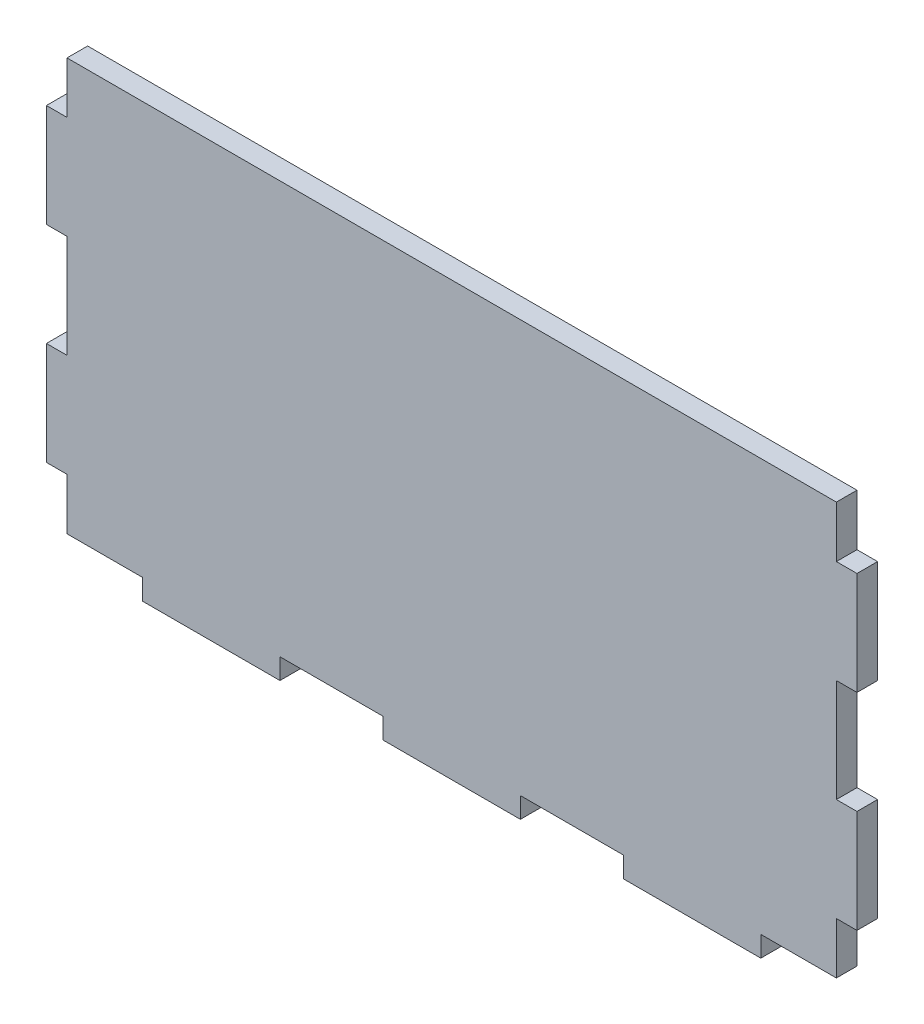
ISO-10303-21;
HEADER;
FILE_DESCRIPTION(('STEP AP214'),'2;1');
FILE_NAME('part.step','',(''),(''),'','','');
FILE_SCHEMA(('AUTOMOTIVE_DESIGN { 1 0 10303 214 1 1 1 1 }'));
ENDSEC;
DATA;
#1=APPLICATION_CONTEXT('core data for automotive mechanical design processes');
#2=APPLICATION_PROTOCOL_DEFINITION('international standard','automotive_design',2000,#1);
#3=PRODUCT_CONTEXT('',#1,'mechanical');
#4=PRODUCT('Part','Part','',(#3));
#5=PRODUCT_RELATED_PRODUCT_CATEGORY('part','',(#4));
#6=PRODUCT_DEFINITION_FORMATION('','',#4);
#7=PRODUCT_DEFINITION_CONTEXT('part definition',#1,'design');
#8=PRODUCT_DEFINITION('design','',#6,#7);
#9=PRODUCT_DEFINITION_SHAPE('','',#8);
#10=(LENGTH_UNIT() NAMED_UNIT(*) SI_UNIT(.MILLI.,.METRE.));
#11=(NAMED_UNIT(*) PLANE_ANGLE_UNIT() SI_UNIT($,.RADIAN.));
#12=(NAMED_UNIT(*) SI_UNIT($,.STERADIAN.) SOLID_ANGLE_UNIT());
#13=UNCERTAINTY_MEASURE_WITH_UNIT(LENGTH_MEASURE(1.E-05),#10,'distance_accuracy_value','');
#14=(GEOMETRIC_REPRESENTATION_CONTEXT(3) GLOBAL_UNCERTAINTY_ASSIGNED_CONTEXT((#13)) GLOBAL_UNIT_ASSIGNED_CONTEXT((#10,
#11,#12)) REPRESENTATION_CONTEXT('',''));
#15=CARTESIAN_POINT('',(0.,0.,0.));
#16=DIRECTION('',(0.,0.,1.));
#17=DIRECTION('',(1.,0.,0.));
#18=AXIS2_PLACEMENT_3D('',#15,#16,#17);
#19=CARTESIAN_POINT('',(0.,22.5,3.));
#20=DIRECTION('',(0.,1.,0.));
#21=DIRECTION('',(0.,0.,1.));
#22=AXIS2_PLACEMENT_3D('',#19,#20,#21);
#23=PLANE('',#22);
#24=DIRECTION('',(1.,0.,0.));
#25=VECTOR('',#24,1.);
#26=CARTESIAN_POINT('',(0.,22.5,0.));
#27=LINE('',#26,#25);
#28=CARTESIAN_POINT('',(-59.,22.5,0.));
#29=VERTEX_POINT('',#28);
#30=CARTESIAN_POINT('',(-56.,22.5,0.));
#31=VERTEX_POINT('',#30);
#32=EDGE_CURVE('E499',#29,#31,#27,.T.);
#33=ORIENTED_EDGE('',*,*,#32,.F.);
#34=DIRECTION('',(0.,0.,-1.));
#35=VECTOR('',#34,1.);
#36=CARTESIAN_POINT('',(-59.,22.5,3.));
#37=LINE('',#36,#35);
#38=CARTESIAN_POINT('',(-59.,22.5,3.));
#39=VERTEX_POINT('',#38);
#40=EDGE_CURVE('E504',#39,#29,#37,.T.);
#41=ORIENTED_EDGE('',*,*,#40,.F.);
#42=DIRECTION('',(1.,0.,0.));
#43=VECTOR('',#42,1.);
#44=CARTESIAN_POINT('',(0.,22.5,3.));
#45=LINE('',#44,#43);
#46=CARTESIAN_POINT('',(-56.,22.5,3.));
#47=VERTEX_POINT('',#46);
#48=EDGE_CURVE('E509',#39,#47,#45,.T.);
#49=ORIENTED_EDGE('',*,*,#48,.T.);
#50=DIRECTION('',(0.,0.,-1.));
#51=VECTOR('',#50,1.);
#52=CARTESIAN_POINT('',(-56.,22.5,3.));
#53=LINE('',#52,#51);
#54=EDGE_CURVE('E508',#47,#31,#53,.T.);
#55=ORIENTED_EDGE('',*,*,#54,.T.);
#56=EDGE_LOOP('',(#33,#41,#49,#55));
#57=FACE_BOUND('',#56,.T.);
#58=ADVANCED_FACE('F215',(#57),#23,.T.);
#59=CARTESIAN_POINT('',(-56.,0.,3.));
#60=DIRECTION('',(-1.,0.,0.));
#61=DIRECTION('',(0.,0.,1.));
#62=AXIS2_PLACEMENT_3D('',#59,#60,#61);
#63=PLANE('',#62);
#64=DIRECTION('',(0.,1.,0.));
#65=VECTOR('',#64,1.);
#66=CARTESIAN_POINT('',(-56.,0.,0.));
#67=LINE('',#66,#65);
#68=CARTESIAN_POINT('',(-56.,30.,0.));
#69=VERTEX_POINT('',#68);
#70=EDGE_CURVE('E498',#31,#69,#67,.T.);
#71=ORIENTED_EDGE('',*,*,#70,.F.);
#72=ORIENTED_EDGE('',*,*,#54,.F.);
#73=DIRECTION('',(0.,1.,0.));
#74=VECTOR('',#73,1.);
#75=CARTESIAN_POINT('',(-56.,0.,3.));
#76=LINE('',#75,#74);
#77=CARTESIAN_POINT('',(-56.,30.,3.));
#78=VERTEX_POINT('',#77);
#79=EDGE_CURVE('E750',#47,#78,#76,.T.);
#80=ORIENTED_EDGE('',*,*,#79,.T.);
#81=DIRECTION('',(0.,0.,-1.));
#82=VECTOR('',#81,1.);
#83=CARTESIAN_POINT('',(-56.,30.,3.));
#84=LINE('',#83,#82);
#85=EDGE_CURVE('E513',#78,#69,#84,.T.);
#86=ORIENTED_EDGE('',*,*,#85,.T.);
#87=EDGE_LOOP('',(#71,#72,#80,#86));
#88=FACE_BOUND('',#87,.T.);
#89=ADVANCED_FACE('F381',(#88),#63,.T.);
#90=CARTESIAN_POINT('',(45.,0.,3.));
#91=DIRECTION('',(-1.,0.,0.));
#92=DIRECTION('',(0.,0.,1.));
#93=AXIS2_PLACEMENT_3D('',#90,#91,#92);
#94=PLANE('',#93);
#95=DIRECTION('',(0.,1.,0.));
#96=VECTOR('',#95,1.);
#97=CARTESIAN_POINT('',(45.,0.,0.));
#98=LINE('',#97,#96);
#99=CARTESIAN_POINT('',(45.,-33.,0.));
#100=VERTEX_POINT('',#99);
#101=CARTESIAN_POINT('',(45.,-30.,0.));
#102=VERTEX_POINT('',#101);
#103=EDGE_CURVE('E493',#100,#102,#98,.T.);
#104=ORIENTED_EDGE('',*,*,#103,.T.);
#105=DIRECTION('',(0.,0.,-1.));
#106=VECTOR('',#105,1.);
#107=CARTESIAN_POINT('',(45.,-30.,3.));
#108=LINE('',#107,#106);
#109=CARTESIAN_POINT('',(45.,-30.,3.));
#110=VERTEX_POINT('',#109);
#111=EDGE_CURVE('E525',#110,#102,#108,.T.);
#112=ORIENTED_EDGE('',*,*,#111,.F.);
#113=DIRECTION('',(0.,1.,0.));
#114=VECTOR('',#113,1.);
#115=CARTESIAN_POINT('',(45.,0.,3.));
#116=LINE('',#115,#114);
#117=CARTESIAN_POINT('',(45.,-33.,3.));
#118=VERTEX_POINT('',#117);
#119=EDGE_CURVE('E757',#118,#110,#116,.T.);
#120=ORIENTED_EDGE('',*,*,#119,.F.);
#121=DIRECTION('',(0.,0.,-1.));
#122=VECTOR('',#121,1.);
#123=CARTESIAN_POINT('',(45.,-33.,3.));
#124=LINE('',#123,#122);
#125=EDGE_CURVE('E529',#118,#100,#124,.T.);
#126=ORIENTED_EDGE('',*,*,#125,.T.);
#127=EDGE_LOOP('',(#104,#112,#120,#126));
#128=FACE_BOUND('',#127,.T.);
#129=ADVANCED_FACE('F387',(#128),#94,.F.);
#130=CARTESIAN_POINT('',(0.,-33.,3.));
#131=DIRECTION('',(0.,1.,0.));
#132=DIRECTION('',(0.,0.,1.));
#133=AXIS2_PLACEMENT_3D('',#130,#131,#132);
#134=PLANE('',#133);
#135=DIRECTION('',(1.,0.,0.));
#136=VECTOR('',#135,1.);
#137=CARTESIAN_POINT('',(0.,-33.,0.));
#138=LINE('',#137,#136);
#139=CARTESIAN_POINT('',(25.,-33.,0.));
#140=VERTEX_POINT('',#139);
#141=EDGE_CURVE('E661',#140,#100,#138,.T.);
#142=ORIENTED_EDGE('',*,*,#141,.T.);
#143=ORIENTED_EDGE('',*,*,#125,.F.);
#144=DIRECTION('',(1.,0.,0.));
#145=VECTOR('',#144,1.);
#146=CARTESIAN_POINT('',(0.,-33.,3.));
#147=LINE('',#146,#145);
#148=CARTESIAN_POINT('',(25.,-33.,3.));
#149=VERTEX_POINT('',#148);
#150=EDGE_CURVE('E764',#149,#118,#147,.T.);
#151=ORIENTED_EDGE('',*,*,#150,.F.);
#152=DIRECTION('',(0.,0.,-1.));
#153=VECTOR('',#152,1.);
#154=CARTESIAN_POINT('',(25.,-33.,3.));
#155=LINE('',#154,#153);
#156=EDGE_CURVE('E533',#149,#140,#155,.T.);
#157=ORIENTED_EDGE('',*,*,#156,.T.);
#158=EDGE_LOOP('',(#142,#143,#151,#157));
#159=FACE_BOUND('',#158,.T.);
#160=ADVANCED_FACE('F413',(#159),#134,.F.);
#161=CARTESIAN_POINT('',(25.,0.,3.));
#162=DIRECTION('',(-1.,0.,0.));
#163=DIRECTION('',(0.,0.,1.));
#164=AXIS2_PLACEMENT_3D('',#161,#162,#163);
#165=PLANE('',#164);
#166=DIRECTION('',(0.,1.,0.));
#167=VECTOR('',#166,1.);
#168=CARTESIAN_POINT('',(25.,0.,0.));
#169=LINE('',#168,#167);
#170=CARTESIAN_POINT('',(25.,-30.,0.));
#171=VERTEX_POINT('',#170);
#172=EDGE_CURVE('E658',#140,#171,#169,.T.);
#173=ORIENTED_EDGE('',*,*,#172,.F.);
#174=ORIENTED_EDGE('',*,*,#156,.F.);
#175=DIRECTION('',(0.,1.,0.));
#176=VECTOR('',#175,1.);
#177=CARTESIAN_POINT('',(25.,0.,3.));
#178=LINE('',#177,#176);
#179=CARTESIAN_POINT('',(25.,-30.,3.));
#180=VERTEX_POINT('',#179);
#181=EDGE_CURVE('E769',#149,#180,#178,.T.);
#182=ORIENTED_EDGE('',*,*,#181,.T.);
#183=DIRECTION('',(0.,0.,-1.));
#184=VECTOR('',#183,1.);
#185=CARTESIAN_POINT('',(25.,-30.,3.));
#186=LINE('',#185,#184);
#187=EDGE_CURVE('E537',#180,#171,#186,.T.);
#188=ORIENTED_EDGE('',*,*,#187,.T.);
#189=EDGE_LOOP('',(#173,#174,#182,#188));
#190=FACE_BOUND('',#189,.T.);
#191=ADVANCED_FACE('F417',(#190),#165,.T.);
#192=CARTESIAN_POINT('',(0.,-30.,3.));
#193=DIRECTION('',(0.,-1.,0.));
#194=DIRECTION('',(1.,0.,0.));
#195=AXIS2_PLACEMENT_3D('',#192,#193,#194);
#196=PLANE('',#195);
#197=DIRECTION('',(-1.,0.,0.));
#198=VECTOR('',#197,1.);
#199=CARTESIAN_POINT('',(0.,-30.,0.));
#200=LINE('',#199,#198);
#201=CARTESIAN_POINT('',(9.99999999999999,-30.,0.));
#202=VERTEX_POINT('',#201);
#203=EDGE_CURVE('E657',#171,#202,#200,.T.);
#204=ORIENTED_EDGE('',*,*,#203,.F.);
#205=ORIENTED_EDGE('',*,*,#187,.F.);
#206=DIRECTION('',(-1.,0.,0.));
#207=VECTOR('',#206,1.);
#208=CARTESIAN_POINT('',(0.,-30.,3.));
#209=LINE('',#208,#207);
#210=CARTESIAN_POINT('',(9.99999999999999,-30.,3.));
#211=VERTEX_POINT('',#210);
#212=EDGE_CURVE('E759',#180,#211,#209,.T.);
#213=ORIENTED_EDGE('',*,*,#212,.T.);
#214=DIRECTION('',(0.,0.,-1.));
#215=VECTOR('',#214,1.);
#216=CARTESIAN_POINT('',(9.99999999999999,-30.,3.));
#217=LINE('',#216,#215);
#218=EDGE_CURVE('E541',#211,#202,#217,.T.);
#219=ORIENTED_EDGE('',*,*,#218,.T.);
#220=EDGE_LOOP('',(#204,#205,#213,#219));
#221=FACE_BOUND('',#220,.T.);
#222=ADVANCED_FACE('F410',(#221),#196,.T.);
#223=CARTESIAN_POINT('',(9.99999999999999,0.,3.));
#224=DIRECTION('',(-1.,0.,0.));
#225=DIRECTION('',(0.,0.,1.));
#226=AXIS2_PLACEMENT_3D('',#223,#224,#225);
#227=PLANE('',#226);
#228=DIRECTION('',(0.,1.,0.));
#229=VECTOR('',#228,1.);
#230=CARTESIAN_POINT('',(9.99999999999999,0.,0.));
#231=LINE('',#230,#229);
#232=CARTESIAN_POINT('',(9.99999999999999,-33.,0.));
#233=VERTEX_POINT('',#232);
#234=EDGE_CURVE('E653',#233,#202,#231,.T.);
#235=ORIENTED_EDGE('',*,*,#234,.T.);
#236=ORIENTED_EDGE('',*,*,#218,.F.);
#237=DIRECTION('',(0.,1.,0.));
#238=VECTOR('',#237,1.);
#239=CARTESIAN_POINT('',(9.99999999999999,0.,3.));
#240=LINE('',#239,#238);
#241=CARTESIAN_POINT('',(9.99999999999999,-33.,3.));
#242=VERTEX_POINT('',#241);
#243=EDGE_CURVE('E770',#242,#211,#240,.T.);
#244=ORIENTED_EDGE('',*,*,#243,.F.);
#245=DIRECTION('',(0.,0.,-1.));
#246=VECTOR('',#245,1.);
#247=CARTESIAN_POINT('',(9.99999999999999,-33.,3.));
#248=LINE('',#247,#246);
#249=EDGE_CURVE('E545',#242,#233,#248,.T.);
#250=ORIENTED_EDGE('',*,*,#249,.T.);
#251=EDGE_LOOP('',(#235,#236,#244,#250));
#252=FACE_BOUND('',#251,.T.);
#253=ADVANCED_FACE('F422',(#252),#227,.F.);
#254=CARTESIAN_POINT('',(0.,-33.,3.));
#255=DIRECTION('',(0.,1.,0.));
#256=DIRECTION('',(0.,0.,1.));
#257=AXIS2_PLACEMENT_3D('',#254,#255,#256);
#258=PLANE('',#257);
#259=DIRECTION('',(1.,0.,0.));
#260=VECTOR('',#259,1.);
#261=CARTESIAN_POINT('',(0.,-33.,0.));
#262=LINE('',#261,#260);
#263=CARTESIAN_POINT('',(-10.,-33.,0.));
#264=VERTEX_POINT('',#263);
#265=EDGE_CURVE('E649',#264,#233,#262,.T.);
#266=ORIENTED_EDGE('',*,*,#265,.T.);
#267=ORIENTED_EDGE('',*,*,#249,.F.);
#268=DIRECTION('',(1.,0.,0.));
#269=VECTOR('',#268,1.);
#270=CARTESIAN_POINT('',(0.,-33.,3.));
#271=LINE('',#270,#269);
#272=CARTESIAN_POINT('',(-10.,-33.,3.));
#273=VERTEX_POINT('',#272);
#274=EDGE_CURVE('E794',#273,#242,#271,.T.);
#275=ORIENTED_EDGE('',*,*,#274,.F.);
#276=DIRECTION('',(0.,0.,-1.));
#277=VECTOR('',#276,1.);
#278=CARTESIAN_POINT('',(-10.,-33.,3.));
#279=LINE('',#278,#277);
#280=EDGE_CURVE('E549',#273,#264,#279,.T.);
#281=ORIENTED_EDGE('',*,*,#280,.T.);
#282=EDGE_LOOP('',(#266,#267,#275,#281));
#283=FACE_BOUND('',#282,.T.);
#284=ADVANCED_FACE('F425',(#283),#258,.F.);
#285=CARTESIAN_POINT('',(-10.,0.,3.));
#286=DIRECTION('',(-1.,0.,0.));
#287=DIRECTION('',(0.,0.,1.));
#288=AXIS2_PLACEMENT_3D('',#285,#286,#287);
#289=PLANE('',#288);
#290=DIRECTION('',(0.,1.,0.));
#291=VECTOR('',#290,1.);
#292=CARTESIAN_POINT('',(-10.,0.,0.));
#293=LINE('',#292,#291);
#294=CARTESIAN_POINT('',(-10.,-30.,0.));
#295=VERTEX_POINT('',#294);
#296=EDGE_CURVE('E645',#264,#295,#293,.T.);
#297=ORIENTED_EDGE('',*,*,#296,.F.);
#298=ORIENTED_EDGE('',*,*,#280,.F.);
#299=DIRECTION('',(0.,1.,0.));
#300=VECTOR('',#299,1.);
#301=CARTESIAN_POINT('',(-10.,0.,3.));
#302=LINE('',#301,#300);
#303=CARTESIAN_POINT('',(-10.,-30.,3.));
#304=VERTEX_POINT('',#303);
#305=EDGE_CURVE('E789',#273,#304,#302,.T.);
#306=ORIENTED_EDGE('',*,*,#305,.T.);
#307=DIRECTION('',(0.,0.,-1.));
#308=VECTOR('',#307,1.);
#309=CARTESIAN_POINT('',(-10.,-30.,3.));
#310=LINE('',#309,#308);
#311=EDGE_CURVE('E553',#304,#295,#310,.T.);
#312=ORIENTED_EDGE('',*,*,#311,.T.);
#313=EDGE_LOOP('',(#297,#298,#306,#312));
#314=FACE_BOUND('',#313,.T.);
#315=ADVANCED_FACE('F429',(#314),#289,.T.);
#316=CARTESIAN_POINT('',(-25.,-30.,0.));
#317=VERTEX_POINT('',#316);
#318=EDGE_CURVE('E633',#295,#317,#200,.T.);
#319=ORIENTED_EDGE('',*,*,#318,.F.);
#320=ORIENTED_EDGE('',*,*,#311,.F.);
#321=CARTESIAN_POINT('',(-25.,-30.,3.));
#322=VERTEX_POINT('',#321);
#323=EDGE_CURVE('E771',#304,#322,#209,.T.);
#324=ORIENTED_EDGE('',*,*,#323,.T.);
#325=DIRECTION('',(0.,0.,-1.));
#326=VECTOR('',#325,1.);
#327=CARTESIAN_POINT('',(-25.,-30.,3.));
#328=LINE('',#327,#326);
#329=EDGE_CURVE('E557',#322,#317,#328,.T.);
#330=ORIENTED_EDGE('',*,*,#329,.T.);
#331=EDGE_LOOP('',(#319,#320,#324,#330));
#332=FACE_BOUND('',#331,.T.);
#333=ADVANCED_FACE('F433',(#332),#196,.T.);
#334=CARTESIAN_POINT('',(-25.,0.,3.));
#335=DIRECTION('',(-1.,0.,0.));
#336=DIRECTION('',(0.,0.,1.));
#337=AXIS2_PLACEMENT_3D('',#334,#335,#336);
#338=PLANE('',#337);
#339=DIRECTION('',(0.,1.,0.));
#340=VECTOR('',#339,1.);
#341=CARTESIAN_POINT('',(-25.,0.,0.));
#342=LINE('',#341,#340);
#343=CARTESIAN_POINT('',(-25.,-33.,0.));
#344=VERTEX_POINT('',#343);
#345=EDGE_CURVE('E641',#344,#317,#342,.T.);
#346=ORIENTED_EDGE('',*,*,#345,.T.);
#347=ORIENTED_EDGE('',*,*,#329,.F.);
#348=DIRECTION('',(0.,1.,0.));
#349=VECTOR('',#348,1.);
#350=CARTESIAN_POINT('',(-25.,0.,3.));
#351=LINE('',#350,#349);
#352=CARTESIAN_POINT('',(-25.,-33.,3.));
#353=VERTEX_POINT('',#352);
#354=EDGE_CURVE('E790',#353,#322,#351,.T.);
#355=ORIENTED_EDGE('',*,*,#354,.F.);
#356=DIRECTION('',(0.,0.,-1.));
#357=VECTOR('',#356,1.);
#358=CARTESIAN_POINT('',(-25.,-33.,3.));
#359=LINE('',#358,#357);
#360=EDGE_CURVE('E561',#353,#344,#359,.T.);
#361=ORIENTED_EDGE('',*,*,#360,.T.);
#362=EDGE_LOOP('',(#346,#347,#355,#361));
#363=FACE_BOUND('',#362,.T.);
#364=ADVANCED_FACE('F435',(#363),#338,.F.);
#365=CARTESIAN_POINT('',(0.,-33.,3.));
#366=DIRECTION('',(0.,-1.,0.));
#367=DIRECTION('',(0.,0.,-1.));
#368=AXIS2_PLACEMENT_3D('',#365,#366,#367);
#369=PLANE('',#368);
#370=DIRECTION('',(-1.,0.,0.));
#371=VECTOR('',#370,1.);
#372=CARTESIAN_POINT('',(0.,-33.,0.));
#373=LINE('',#372,#371);
#374=CARTESIAN_POINT('',(-45.,-33.,0.));
#375=VERTEX_POINT('',#374);
#376=EDGE_CURVE('E637',#344,#375,#373,.T.);
#377=ORIENTED_EDGE('',*,*,#376,.F.);
#378=ORIENTED_EDGE('',*,*,#360,.F.);
#379=DIRECTION('',(-1.,0.,0.));
#380=VECTOR('',#379,1.);
#381=CARTESIAN_POINT('',(0.,-33.,3.));
#382=LINE('',#381,#380);
#383=CARTESIAN_POINT('',(-45.,-33.,3.));
#384=VERTEX_POINT('',#383);
#385=EDGE_CURVE('E783',#353,#384,#382,.T.);
#386=ORIENTED_EDGE('',*,*,#385,.T.);
#387=DIRECTION('',(0.,0.,-1.));
#388=VECTOR('',#387,1.);
#389=CARTESIAN_POINT('',(-45.,-33.,3.));
#390=LINE('',#389,#388);
#391=EDGE_CURVE('E565',#384,#375,#390,.T.);
#392=ORIENTED_EDGE('',*,*,#391,.T.);
#393=EDGE_LOOP('',(#377,#378,#386,#392));
#394=FACE_BOUND('',#393,.T.);
#395=ADVANCED_FACE('F438',(#394),#369,.T.);
#396=CARTESIAN_POINT('',(-45.,0.,3.));
#397=DIRECTION('',(-1.,0.,0.));
#398=DIRECTION('',(0.,0.,1.));
#399=AXIS2_PLACEMENT_3D('',#396,#397,#398);
#400=PLANE('',#399);
#401=DIRECTION('',(0.,1.,0.));
#402=VECTOR('',#401,1.);
#403=CARTESIAN_POINT('',(-45.,0.,0.));
#404=LINE('',#403,#402);
#405=CARTESIAN_POINT('',(-45.,-30.,0.));
#406=VERTEX_POINT('',#405);
#407=EDGE_CURVE('E632',#375,#406,#404,.T.);
#408=ORIENTED_EDGE('',*,*,#407,.F.);
#409=ORIENTED_EDGE('',*,*,#391,.F.);
#410=DIRECTION('',(0.,1.,0.));
#411=VECTOR('',#410,1.);
#412=CARTESIAN_POINT('',(-45.,0.,3.));
#413=LINE('',#412,#411);
#414=CARTESIAN_POINT('',(-45.,-30.,3.));
#415=VERTEX_POINT('',#414);
#416=EDGE_CURVE('E774',#384,#415,#413,.T.);
#417=ORIENTED_EDGE('',*,*,#416,.T.);
#418=DIRECTION('',(0.,0.,-1.));
#419=VECTOR('',#418,1.);
#420=CARTESIAN_POINT('',(-45.,-30.,3.));
#421=LINE('',#420,#419);
#422=EDGE_CURVE('E569',#415,#406,#421,.T.);
#423=ORIENTED_EDGE('',*,*,#422,.T.);
#424=EDGE_LOOP('',(#408,#409,#417,#423));
#425=FACE_BOUND('',#424,.T.);
#426=ADVANCED_FACE('F442',(#425),#400,.T.);
#427=CARTESIAN_POINT('',(-56.,-30.,0.));
#428=VERTEX_POINT('',#427);
#429=EDGE_CURVE('E628',#406,#428,#200,.T.);
#430=ORIENTED_EDGE('',*,*,#429,.F.);
#431=ORIENTED_EDGE('',*,*,#422,.F.);
#432=CARTESIAN_POINT('',(-56.,-30.,3.));
#433=VERTEX_POINT('',#432);
#434=EDGE_CURVE('E760',#415,#433,#209,.T.);
#435=ORIENTED_EDGE('',*,*,#434,.T.);
#436=DIRECTION('',(0.,0.,-1.));
#437=VECTOR('',#436,1.);
#438=CARTESIAN_POINT('',(-56.,-30.,3.));
#439=LINE('',#438,#437);
#440=EDGE_CURVE('E573',#433,#428,#439,.T.);
#441=ORIENTED_EDGE('',*,*,#440,.T.);
#442=EDGE_LOOP('',(#430,#431,#435,#441));
#443=FACE_BOUND('',#442,.T.);
#444=ADVANCED_FACE('F409',(#443),#196,.T.);
#445=CARTESIAN_POINT('',(-56.,-22.5,0.));
#446=VERTEX_POINT('',#445);
#447=EDGE_CURVE('E614',#428,#446,#67,.T.);
#448=ORIENTED_EDGE('',*,*,#447,.F.);
#449=ORIENTED_EDGE('',*,*,#440,.F.);
#450=CARTESIAN_POINT('',(-56.,-22.5,3.));
#451=VERTEX_POINT('',#450);
#452=EDGE_CURVE('E775',#433,#451,#76,.T.);
#453=ORIENTED_EDGE('',*,*,#452,.T.);
#454=DIRECTION('',(0.,0.,-1.));
#455=VECTOR('',#454,1.);
#456=CARTESIAN_POINT('',(-56.,-22.5,3.));
#457=LINE('',#456,#455);
#458=EDGE_CURVE('E577',#451,#446,#457,.T.);
#459=ORIENTED_EDGE('',*,*,#458,.T.);
#460=EDGE_LOOP('',(#448,#449,#453,#459));
#461=FACE_BOUND('',#460,.T.);
#462=ADVANCED_FACE('F391',(#461),#63,.T.);
#463=CARTESIAN_POINT('',(0.,-22.5,3.));
#464=DIRECTION('',(0.,1.,0.));
#465=DIRECTION('',(0.,0.,1.));
#466=AXIS2_PLACEMENT_3D('',#463,#464,#465);
#467=PLANE('',#466);
#468=DIRECTION('',(1.,0.,0.));
#469=VECTOR('',#468,1.);
#470=CARTESIAN_POINT('',(0.,-22.5,0.));
#471=LINE('',#470,#469);
#472=CARTESIAN_POINT('',(-59.,-22.5,0.));
#473=VERTEX_POINT('',#472);
#474=EDGE_CURVE('E621',#473,#446,#471,.T.);
#475=ORIENTED_EDGE('',*,*,#474,.T.);
#476=ORIENTED_EDGE('',*,*,#458,.F.);
#477=DIRECTION('',(1.,0.,0.));
#478=VECTOR('',#477,1.);
#479=CARTESIAN_POINT('',(0.,-22.5,3.));
#480=LINE('',#479,#478);
#481=CARTESIAN_POINT('',(-59.,-22.5,3.));
#482=VERTEX_POINT('',#481);
#483=EDGE_CURVE('E785',#482,#451,#480,.T.);
#484=ORIENTED_EDGE('',*,*,#483,.F.);
#485=DIRECTION('',(0.,0.,-1.));
#486=VECTOR('',#485,1.);
#487=CARTESIAN_POINT('',(-59.,-22.5,3.));
#488=LINE('',#487,#486);
#489=EDGE_CURVE('E581',#482,#473,#488,.T.);
#490=ORIENTED_EDGE('',*,*,#489,.T.);
#491=EDGE_LOOP('',(#475,#476,#484,#490));
#492=FACE_BOUND('',#491,.T.);
#493=ADVANCED_FACE('F447',(#492),#467,.F.);
#494=CARTESIAN_POINT('',(-59.,0.,3.));
#495=DIRECTION('',(-1.,0.,0.));
#496=DIRECTION('',(0.,0.,1.));
#497=AXIS2_PLACEMENT_3D('',#494,#495,#496);
#498=PLANE('',#497);
#499=DIRECTION('',(0.,1.,0.));
#500=VECTOR('',#499,1.);
#501=CARTESIAN_POINT('',(-59.,0.,0.));
#502=LINE('',#501,#500);
#503=CARTESIAN_POINT('',(-59.,-7.49999999999999,0.));
#504=VERTEX_POINT('',#503);
#505=EDGE_CURVE('E617',#473,#504,#502,.T.);
#506=ORIENTED_EDGE('',*,*,#505,.F.);
#507=ORIENTED_EDGE('',*,*,#489,.F.);
#508=DIRECTION('',(0.,1.,0.));
#509=VECTOR('',#508,1.);
#510=CARTESIAN_POINT('',(-59.,0.,3.));
#511=LINE('',#510,#509);
#512=CARTESIAN_POINT('',(-59.,-7.49999999999999,3.));
#513=VERTEX_POINT('',#512);
#514=EDGE_CURVE('E1214',#482,#513,#511,.T.);
#515=ORIENTED_EDGE('',*,*,#514,.T.);
#516=DIRECTION('',(0.,0.,-1.));
#517=VECTOR('',#516,1.);
#518=CARTESIAN_POINT('',(-59.,-7.49999999999999,3.));
#519=LINE('',#518,#517);
#520=EDGE_CURVE('E585',#513,#504,#519,.T.);
#521=ORIENTED_EDGE('',*,*,#520,.T.);
#522=EDGE_LOOP('',(#506,#507,#515,#521));
#523=FACE_BOUND('',#522,.T.);
#524=ADVANCED_FACE('F450',(#523),#498,.T.);
#525=CARTESIAN_POINT('',(0.,-7.49999999999999,3.));
#526=DIRECTION('',(0.,1.,0.));
#527=DIRECTION('',(0.,0.,1.));
#528=AXIS2_PLACEMENT_3D('',#525,#526,#527);
#529=PLANE('',#528);
#530=DIRECTION('',(1.,0.,0.));
#531=VECTOR('',#530,1.);
#532=CARTESIAN_POINT('',(0.,-7.49999999999999,0.));
#533=LINE('',#532,#531);
#534=CARTESIAN_POINT('',(-56.,-7.49999999999999,0.));
#535=VERTEX_POINT('',#534);
#536=EDGE_CURVE('E598',#504,#535,#533,.T.);
#537=ORIENTED_EDGE('',*,*,#536,.F.);
#538=ORIENTED_EDGE('',*,*,#520,.F.);
#539=DIRECTION('',(1.,0.,0.));
#540=VECTOR('',#539,1.);
#541=CARTESIAN_POINT('',(0.,-7.49999999999999,3.));
#542=LINE('',#541,#540);
#543=CARTESIAN_POINT('',(-56.,-7.49999999999999,3.));
#544=VERTEX_POINT('',#543);
#545=EDGE_CURVE('E602',#513,#544,#542,.T.);
#546=ORIENTED_EDGE('',*,*,#545,.T.);
#547=DIRECTION('',(0.,0.,-1.));
#548=VECTOR('',#547,1.);
#549=CARTESIAN_POINT('',(-56.,-7.49999999999999,3.));
#550=LINE('',#549,#548);
#551=EDGE_CURVE('E321',#544,#535,#550,.T.);
#552=ORIENTED_EDGE('',*,*,#551,.T.);
#553=EDGE_LOOP('',(#537,#538,#546,#552));
#554=FACE_BOUND('',#553,.T.);
#555=ADVANCED_FACE('F454',(#554),#529,.T.);
#556=CARTESIAN_POINT('',(-56.,7.50000000000001,0.));
#557=VERTEX_POINT('',#556);
#558=EDGE_CURVE('E609',#535,#557,#67,.T.);
#559=ORIENTED_EDGE('',*,*,#558,.F.);
#560=ORIENTED_EDGE('',*,*,#551,.F.);
#561=CARTESIAN_POINT('',(-56.,7.50000000000001,3.));
#562=VERTEX_POINT('',#561);
#563=EDGE_CURVE('E787',#544,#562,#76,.T.);
#564=ORIENTED_EDGE('',*,*,#563,.T.);
#565=DIRECTION('',(0.,0.,-1.));
#566=VECTOR('',#565,1.);
#567=CARTESIAN_POINT('',(-56.,7.50000000000001,3.));
#568=LINE('',#567,#566);
#569=EDGE_CURVE('E312',#562,#557,#568,.T.);
#570=ORIENTED_EDGE('',*,*,#569,.T.);
#571=EDGE_LOOP('',(#559,#560,#564,#570));
#572=FACE_BOUND('',#571,.T.);
#573=ADVANCED_FACE('F390',(#572),#63,.T.);
#574=CARTESIAN_POINT('',(0.,7.50000000000001,3.));
#575=DIRECTION('',(0.,1.,0.));
#576=DIRECTION('',(0.,0.,1.));
#577=AXIS2_PLACEMENT_3D('',#574,#575,#576);
#578=PLANE('',#577);
#579=DIRECTION('',(1.,0.,0.));
#580=VECTOR('',#579,1.);
#581=CARTESIAN_POINT('',(0.,7.50000000000001,0.));
#582=LINE('',#581,#580);
#583=CARTESIAN_POINT('',(-59.,7.50000000000001,0.));
#584=VERTEX_POINT('',#583);
#585=EDGE_CURVE('E612',#584,#557,#582,.T.);
#586=ORIENTED_EDGE('',*,*,#585,.T.);
#587=ORIENTED_EDGE('',*,*,#569,.F.);
#588=DIRECTION('',(1.,0.,0.));
#589=VECTOR('',#588,1.);
#590=CARTESIAN_POINT('',(0.,7.50000000000001,3.));
#591=LINE('',#590,#589);
#592=CARTESIAN_POINT('',(-59.,7.50000000000001,3.));
#593=VERTEX_POINT('',#592);
#594=EDGE_CURVE('E1203',#593,#562,#591,.T.);
#595=ORIENTED_EDGE('',*,*,#594,.F.);
#596=DIRECTION('',(0.,0.,-1.));
#597=VECTOR('',#596,1.);
#598=CARTESIAN_POINT('',(-59.,7.50000000000001,3.));
#599=LINE('',#598,#597);
#600=EDGE_CURVE('E304',#593,#584,#599,.T.);
#601=ORIENTED_EDGE('',*,*,#600,.T.);
#602=EDGE_LOOP('',(#586,#587,#595,#601));
#603=FACE_BOUND('',#602,.T.);
#604=ADVANCED_FACE('F459',(#603),#578,.F.);
#605=CARTESIAN_POINT('',(-59.,0.,3.));
#606=DIRECTION('',(-1.,0.,0.));
#607=DIRECTION('',(0.,0.,1.));
#608=AXIS2_PLACEMENT_3D('',#605,#606,#607);
#609=PLANE('',#608);
#610=DIRECTION('',(0.,1.,0.));
#611=VECTOR('',#610,1.);
#612=CARTESIAN_POINT('',(-59.,0.,0.));
#613=LINE('',#612,#611);
#614=EDGE_CURVE('E350',#584,#29,#613,.T.);
#615=ORIENTED_EDGE('',*,*,#614,.F.);
#616=ORIENTED_EDGE('',*,*,#600,.F.);
#617=DIRECTION('',(0.,1.,0.));
#618=VECTOR('',#617,1.);
#619=CARTESIAN_POINT('',(-59.,0.,3.));
#620=LINE('',#619,#618);
#621=EDGE_CURVE('E503',#593,#39,#620,.T.);
#622=ORIENTED_EDGE('',*,*,#621,.T.);
#623=ORIENTED_EDGE('',*,*,#40,.T.);
#624=EDGE_LOOP('',(#615,#616,#622,#623));
#625=FACE_BOUND('',#624,.T.);
#626=ADVANCED_FACE('F407',(#625),#609,.T.);
#627=CARTESIAN_POINT('',(56.,-30.,0.));
#628=VERTEX_POINT('',#627);
#629=EDGE_CURVE('E490',#628,#102,#200,.T.);
#630=ORIENTED_EDGE('',*,*,#629,.F.);
#631=DIRECTION('',(0.,0.,-1.));
#632=VECTOR('',#631,1.);
#633=CARTESIAN_POINT('',(56.,-30.,3.));
#634=LINE('',#633,#632);
#635=CARTESIAN_POINT('',(56.,-30.,3.));
#636=VERTEX_POINT('',#635);
#637=EDGE_CURVE('E521',#636,#628,#634,.T.);
#638=ORIENTED_EDGE('',*,*,#637,.F.);
#639=EDGE_CURVE('E741',#636,#110,#209,.T.);
#640=ORIENTED_EDGE('',*,*,#639,.T.);
#641=ORIENTED_EDGE('',*,*,#111,.T.);
#642=EDGE_LOOP('',(#630,#638,#640,#641));
#643=FACE_BOUND('',#642,.T.);
#644=ADVANCED_FACE('F399',(#643),#196,.T.);
#645=CARTESIAN_POINT('',(0.,30.,3.));
#646=DIRECTION('',(0.,-1.,0.));
#647=DIRECTION('',(1.,0.,0.));
#648=AXIS2_PLACEMENT_3D('',#645,#646,#647);
#649=PLANE('',#648);
#650=DIRECTION('',(-1.,0.,0.));
#651=VECTOR('',#650,1.);
#652=CARTESIAN_POINT('',(0.,30.,0.));
#653=LINE('',#652,#651);
#654=CARTESIAN_POINT('',(56.,30.,0.));
#655=VERTEX_POINT('',#654);
#656=EDGE_CURVE('E489',#655,#69,#653,.T.);
#657=ORIENTED_EDGE('',*,*,#656,.T.);
#658=ORIENTED_EDGE('',*,*,#85,.F.);
#659=DIRECTION('',(-1.,0.,0.));
#660=VECTOR('',#659,1.);
#661=CARTESIAN_POINT('',(0.,30.,3.));
#662=LINE('',#661,#660);
#663=CARTESIAN_POINT('',(56.,30.,3.));
#664=VERTEX_POINT('',#663);
#665=EDGE_CURVE('E743',#664,#78,#662,.T.);
#666=ORIENTED_EDGE('',*,*,#665,.F.);
#667=DIRECTION('',(0.,0.,-1.));
#668=VECTOR('',#667,1.);
#669=CARTESIAN_POINT('',(56.,30.,3.));
#670=LINE('',#669,#668);
#671=EDGE_CURVE('E517',#664,#655,#670,.T.);
#672=ORIENTED_EDGE('',*,*,#671,.T.);
#673=EDGE_LOOP('',(#657,#658,#666,#672));
#674=FACE_BOUND('',#673,.T.);
#675=ADVANCED_FACE('F396',(#674),#649,.F.);
#676=CARTESIAN_POINT('',(0.,0.,0.));
#677=DIRECTION('',(0.,0.,1.));
#678=DIRECTION('',(1.,0.,0.));
#679=AXIS2_PLACEMENT_3D('',#676,#677,#678);
#680=PLANE('',#679);
#681=ORIENTED_EDGE('',*,*,#614,.T.);
#682=ORIENTED_EDGE('',*,*,#32,.T.);
#683=ORIENTED_EDGE('',*,*,#70,.T.);
#684=ORIENTED_EDGE('',*,*,#656,.F.);
#685=DIRECTION('',(0.,1.,0.));
#686=VECTOR('',#685,1.);
#687=CARTESIAN_POINT('',(56.,0.,0.));
#688=LINE('',#687,#686);
#689=CARTESIAN_POINT('',(56.,22.5,0.));
#690=VERTEX_POINT('',#689);
#691=EDGE_CURVE('E484',#690,#655,#688,.T.);
#692=ORIENTED_EDGE('',*,*,#691,.F.);
#693=DIRECTION('',(-1.,0.,0.));
#694=VECTOR('',#693,1.);
#695=CARTESIAN_POINT('',(59.,22.5,0.));
#696=LINE('',#695,#694);
#697=CARTESIAN_POINT('',(59.,22.5,0.));
#698=VERTEX_POINT('',#697);
#699=EDGE_CURVE('E290',#698,#690,#696,.T.);
#700=ORIENTED_EDGE('',*,*,#699,.F.);
#701=DIRECTION('',(0.,1.,0.));
#702=VECTOR('',#701,1.);
#703=CARTESIAN_POINT('',(59.,7.50000000000001,0.));
#704=LINE('',#703,#702);
#705=CARTESIAN_POINT('',(59.,7.50000000000001,0.));
#706=VERTEX_POINT('',#705);
#707=EDGE_CURVE('E266',#706,#698,#704,.T.);
#708=ORIENTED_EDGE('',*,*,#707,.F.);
#709=DIRECTION('',(-1.,0.,0.));
#710=VECTOR('',#709,1.);
#711=CARTESIAN_POINT('',(59.,7.50000000000001,0.));
#712=LINE('',#711,#710);
#713=CARTESIAN_POINT('',(56.,7.50000000000001,0.));
#714=VERTEX_POINT('',#713);
#715=EDGE_CURVE('E287',#706,#714,#712,.T.);
#716=ORIENTED_EDGE('',*,*,#715,.T.);
#717=CARTESIAN_POINT('',(56.,-7.49999999999999,0.));
#718=VERTEX_POINT('',#717);
#719=EDGE_CURVE('E480',#718,#714,#688,.T.);
#720=ORIENTED_EDGE('',*,*,#719,.F.);
#721=DIRECTION('',(-1.,0.,0.));
#722=VECTOR('',#721,1.);
#723=CARTESIAN_POINT('',(59.,-7.49999999999999,0.));
#724=LINE('',#723,#722);
#725=CARTESIAN_POINT('',(59.,-7.49999999999999,0.));
#726=VERTEX_POINT('',#725);
#727=EDGE_CURVE('E341',#726,#718,#724,.T.);
#728=ORIENTED_EDGE('',*,*,#727,.F.);
#729=DIRECTION('',(0.,1.,0.));
#730=VECTOR('',#729,1.);
#731=CARTESIAN_POINT('',(59.,-22.5,0.));
#732=LINE('',#731,#730);
#733=CARTESIAN_POINT('',(59.,-22.5,0.));
#734=VERTEX_POINT('',#733);
#735=EDGE_CURVE('E330',#734,#726,#732,.T.);
#736=ORIENTED_EDGE('',*,*,#735,.F.);
#737=DIRECTION('',(-1.,0.,0.));
#738=VECTOR('',#737,1.);
#739=CARTESIAN_POINT('',(59.,-22.5,0.));
#740=LINE('',#739,#738);
#741=CARTESIAN_POINT('',(56.,-22.5,0.));
#742=VERTEX_POINT('',#741);
#743=EDGE_CURVE('E277',#734,#742,#740,.T.);
#744=ORIENTED_EDGE('',*,*,#743,.T.);
#745=EDGE_CURVE('E483',#628,#742,#688,.T.);
#746=ORIENTED_EDGE('',*,*,#745,.F.);
#747=ORIENTED_EDGE('',*,*,#629,.T.);
#748=ORIENTED_EDGE('',*,*,#103,.F.);
#749=ORIENTED_EDGE('',*,*,#141,.F.);
#750=ORIENTED_EDGE('',*,*,#172,.T.);
#751=ORIENTED_EDGE('',*,*,#203,.T.);
#752=ORIENTED_EDGE('',*,*,#234,.F.);
#753=ORIENTED_EDGE('',*,*,#265,.F.);
#754=ORIENTED_EDGE('',*,*,#296,.T.);
#755=ORIENTED_EDGE('',*,*,#318,.T.);
#756=ORIENTED_EDGE('',*,*,#345,.F.);
#757=ORIENTED_EDGE('',*,*,#376,.T.);
#758=ORIENTED_EDGE('',*,*,#407,.T.);
#759=ORIENTED_EDGE('',*,*,#429,.T.);
#760=ORIENTED_EDGE('',*,*,#447,.T.);
#761=ORIENTED_EDGE('',*,*,#474,.F.);
#762=ORIENTED_EDGE('',*,*,#505,.T.);
#763=ORIENTED_EDGE('',*,*,#536,.T.);
#764=ORIENTED_EDGE('',*,*,#558,.T.);
#765=ORIENTED_EDGE('',*,*,#585,.F.);
#766=EDGE_LOOP('',(#681,#682,#683,#684,#692,#700,#708,#716,#720,#728,#736,#744,#746,#747,#748,
#749,#750,#751,#752,#753,#754,#755,#756,#757,#758,#759,#760,#761,#762,#763,#764,#765));
#767=FACE_BOUND('',#766,.T.);
#768=ADVANCED_FACE('F284',(#767),#680,.F.);
#769=CARTESIAN_POINT('',(0.,0.,3.));
#770=DIRECTION('',(0.,0.,1.));
#771=DIRECTION('',(1.,0.,0.));
#772=AXIS2_PLACEMENT_3D('',#769,#770,#771);
#773=PLANE('',#772);
#774=ORIENTED_EDGE('',*,*,#621,.F.);
#775=ORIENTED_EDGE('',*,*,#594,.T.);
#776=ORIENTED_EDGE('',*,*,#563,.F.);
#777=ORIENTED_EDGE('',*,*,#545,.F.);
#778=ORIENTED_EDGE('',*,*,#514,.F.);
#779=ORIENTED_EDGE('',*,*,#483,.T.);
#780=ORIENTED_EDGE('',*,*,#452,.F.);
#781=ORIENTED_EDGE('',*,*,#434,.F.);
#782=ORIENTED_EDGE('',*,*,#416,.F.);
#783=ORIENTED_EDGE('',*,*,#385,.F.);
#784=ORIENTED_EDGE('',*,*,#354,.T.);
#785=ORIENTED_EDGE('',*,*,#323,.F.);
#786=ORIENTED_EDGE('',*,*,#305,.F.);
#787=ORIENTED_EDGE('',*,*,#274,.T.);
#788=ORIENTED_EDGE('',*,*,#243,.T.);
#789=ORIENTED_EDGE('',*,*,#212,.F.);
#790=ORIENTED_EDGE('',*,*,#181,.F.);
#791=ORIENTED_EDGE('',*,*,#150,.T.);
#792=ORIENTED_EDGE('',*,*,#119,.T.);
#793=ORIENTED_EDGE('',*,*,#639,.F.);
#794=DIRECTION('',(0.,1.,0.));
#795=VECTOR('',#794,1.);
#796=CARTESIAN_POINT('',(56.,0.,3.));
#797=LINE('',#796,#795);
#798=CARTESIAN_POINT('',(56.,-22.5,3.));
#799=VERTEX_POINT('',#798);
#800=EDGE_CURVE('E734',#636,#799,#797,.T.);
#801=ORIENTED_EDGE('',*,*,#800,.T.);
#802=DIRECTION('',(-1.,0.,0.));
#803=VECTOR('',#802,1.);
#804=CARTESIAN_POINT('',(59.,-22.5,3.));
#805=LINE('',#804,#803);
#806=CARTESIAN_POINT('',(59.,-22.5,3.));
#807=VERTEX_POINT('',#806);
#808=EDGE_CURVE('E325',#807,#799,#805,.T.);
#809=ORIENTED_EDGE('',*,*,#808,.F.);
#810=DIRECTION('',(0.,1.,0.));
#811=VECTOR('',#810,1.);
#812=CARTESIAN_POINT('',(59.,-22.5,3.));
#813=LINE('',#812,#811);
#814=CARTESIAN_POINT('',(59.,-7.49999999999999,3.));
#815=VERTEX_POINT('',#814);
#816=EDGE_CURVE('E334',#807,#815,#813,.T.);
#817=ORIENTED_EDGE('',*,*,#816,.T.);
#818=DIRECTION('',(-1.,0.,0.));
#819=VECTOR('',#818,1.);
#820=CARTESIAN_POINT('',(59.,-7.49999999999999,3.));
#821=LINE('',#820,#819);
#822=CARTESIAN_POINT('',(56.,-7.49999999999999,3.));
#823=VERTEX_POINT('',#822);
#824=EDGE_CURVE('E329',#815,#823,#821,.T.);
#825=ORIENTED_EDGE('',*,*,#824,.T.);
#826=CARTESIAN_POINT('',(56.,7.50000000000001,3.));
#827=VERTEX_POINT('',#826);
#828=EDGE_CURVE('E744',#823,#827,#797,.T.);
#829=ORIENTED_EDGE('',*,*,#828,.T.);
#830=DIRECTION('',(-1.,0.,0.));
#831=VECTOR('',#830,1.);
#832=CARTESIAN_POINT('',(59.,7.50000000000001,3.));
#833=LINE('',#832,#831);
#834=CARTESIAN_POINT('',(59.,7.50000000000001,3.));
#835=VERTEX_POINT('',#834);
#836=EDGE_CURVE('E292',#835,#827,#833,.T.);
#837=ORIENTED_EDGE('',*,*,#836,.F.);
#838=DIRECTION('',(0.,1.,0.));
#839=VECTOR('',#838,1.);
#840=CARTESIAN_POINT('',(59.,7.50000000000001,3.));
#841=LINE('',#840,#839);
#842=CARTESIAN_POINT('',(59.,22.5,3.));
#843=VERTEX_POINT('',#842);
#844=EDGE_CURVE('E271',#835,#843,#841,.T.);
#845=ORIENTED_EDGE('',*,*,#844,.T.);
#846=DIRECTION('',(-1.,0.,0.));
#847=VECTOR('',#846,1.);
#848=CARTESIAN_POINT('',(59.,22.5,3.));
#849=LINE('',#848,#847);
#850=CARTESIAN_POINT('',(56.,22.5,3.));
#851=VERTEX_POINT('',#850);
#852=EDGE_CURVE('E358',#843,#851,#849,.T.);
#853=ORIENTED_EDGE('',*,*,#852,.T.);
#854=EDGE_CURVE('E746',#851,#664,#797,.T.);
#855=ORIENTED_EDGE('',*,*,#854,.T.);
#856=ORIENTED_EDGE('',*,*,#665,.T.);
#857=ORIENTED_EDGE('',*,*,#79,.F.);
#858=ORIENTED_EDGE('',*,*,#48,.F.);
#859=EDGE_LOOP('',(#774,#775,#776,#777,#778,#779,#780,#781,#782,#783,#784,#785,#786,#787,#788,
#789,#790,#791,#792,#793,#801,#809,#817,#825,#829,#837,#845,#853,#855,#856,#857,#858));
#860=FACE_BOUND('',#859,.T.);
#861=ADVANCED_FACE('F364',(#860),#773,.T.);
#862=CARTESIAN_POINT('',(56.,0.,3.));
#863=DIRECTION('',(-1.,0.,0.));
#864=DIRECTION('',(0.,-1.,0.));
#865=AXIS2_PLACEMENT_3D('',#862,#863,#864);
#866=PLANE('',#865);
#867=ORIENTED_EDGE('',*,*,#854,.F.);
#868=DIRECTION('',(0.,0.,-1.));
#869=VECTOR('',#868,1.);
#870=CARTESIAN_POINT('',(56.,22.5,3.));
#871=LINE('',#870,#869);
#872=EDGE_CURVE('E235',#851,#690,#871,.T.);
#873=ORIENTED_EDGE('',*,*,#872,.T.);
#874=ORIENTED_EDGE('',*,*,#691,.T.);
#875=ORIENTED_EDGE('',*,*,#671,.F.);
#876=EDGE_LOOP('',(#867,#873,#874,#875));
#877=FACE_BOUND('',#876,.T.);
#878=ADVANCED_FACE('F401',(#877),#866,.F.);
#879=ORIENTED_EDGE('',*,*,#828,.F.);
#880=DIRECTION('',(0.,0.,-1.));
#881=VECTOR('',#880,1.);
#882=CARTESIAN_POINT('',(56.,-7.49999999999999,3.));
#883=LINE('',#882,#881);
#884=EDGE_CURVE('E226',#823,#718,#883,.T.);
#885=ORIENTED_EDGE('',*,*,#884,.T.);
#886=ORIENTED_EDGE('',*,*,#719,.T.);
#887=DIRECTION('',(0.,0.,-1.));
#888=VECTOR('',#887,1.);
#889=CARTESIAN_POINT('',(56.,7.50000000000001,3.));
#890=LINE('',#889,#888);
#891=EDGE_CURVE('E219',#827,#714,#890,.T.);
#892=ORIENTED_EDGE('',*,*,#891,.F.);
#893=EDGE_LOOP('',(#879,#885,#886,#892));
#894=FACE_BOUND('',#893,.T.);
#895=ADVANCED_FACE('F404',(#894),#866,.F.);
#896=DIRECTION('',(0.,0.,-1.));
#897=VECTOR('',#896,1.);
#898=CARTESIAN_POINT('',(56.,-22.5,3.));
#899=LINE('',#898,#897);
#900=EDGE_CURVE('E12',#799,#742,#899,.T.);
#901=ORIENTED_EDGE('',*,*,#900,.F.);
#902=ORIENTED_EDGE('',*,*,#800,.F.);
#903=ORIENTED_EDGE('',*,*,#637,.T.);
#904=ORIENTED_EDGE('',*,*,#745,.T.);
#905=EDGE_LOOP('',(#901,#902,#903,#904));
#906=FACE_BOUND('',#905,.T.);
#907=ADVANCED_FACE('F374',(#906),#866,.F.);
#908=CARTESIAN_POINT('',(59.,7.50000000000001,3.));
#909=DIRECTION('',(-1.,0.,0.));
#910=DIRECTION('',(0.,0.,1.));
#911=AXIS2_PLACEMENT_3D('',#908,#909,#910);
#912=PLANE('',#911);
#913=ORIENTED_EDGE('',*,*,#707,.T.);
#914=DIRECTION('',(0.,0.,-1.));
#915=VECTOR('',#914,1.);
#916=CARTESIAN_POINT('',(59.,22.5,3.));
#917=LINE('',#916,#915);
#918=EDGE_CURVE('E278',#843,#698,#917,.T.);
#919=ORIENTED_EDGE('',*,*,#918,.F.);
#920=ORIENTED_EDGE('',*,*,#844,.F.);
#921=DIRECTION('',(0.,0.,-1.));
#922=VECTOR('',#921,1.);
#923=CARTESIAN_POINT('',(59.,7.50000000000001,3.));
#924=LINE('',#923,#922);
#925=EDGE_CURVE('E269',#835,#706,#924,.T.);
#926=ORIENTED_EDGE('',*,*,#925,.T.);
#927=EDGE_LOOP('',(#913,#919,#920,#926));
#928=FACE_BOUND('',#927,.T.);
#929=ADVANCED_FACE('F270',(#928),#912,.F.);
#930=CARTESIAN_POINT('',(59.,22.5,3.));
#931=DIRECTION('',(0.,-1.,0.));
#932=DIRECTION('',(0.,0.,-1.));
#933=AXIS2_PLACEMENT_3D('',#930,#931,#932);
#934=PLANE('',#933);
#935=ORIENTED_EDGE('',*,*,#699,.T.);
#936=ORIENTED_EDGE('',*,*,#872,.F.);
#937=ORIENTED_EDGE('',*,*,#852,.F.);
#938=ORIENTED_EDGE('',*,*,#918,.T.);
#939=EDGE_LOOP('',(#935,#936,#937,#938));
#940=FACE_BOUND('',#939,.T.);
#941=ADVANCED_FACE('F366',(#940),#934,.F.);
#942=CARTESIAN_POINT('',(59.,7.50000000000001,3.));
#943=DIRECTION('',(0.,-1.,0.));
#944=DIRECTION('',(0.,0.,-1.));
#945=AXIS2_PLACEMENT_3D('',#942,#943,#944);
#946=PLANE('',#945);
#947=ORIENTED_EDGE('',*,*,#715,.F.);
#948=ORIENTED_EDGE('',*,*,#925,.F.);
#949=ORIENTED_EDGE('',*,*,#836,.T.);
#950=ORIENTED_EDGE('',*,*,#891,.T.);
#951=EDGE_LOOP('',(#947,#948,#949,#950));
#952=FACE_BOUND('',#951,.T.);
#953=ADVANCED_FACE('F217',(#952),#946,.T.);
#954=CARTESIAN_POINT('',(59.,-22.5,3.));
#955=DIRECTION('',(-1.,0.,0.));
#956=DIRECTION('',(0.,0.,1.));
#957=AXIS2_PLACEMENT_3D('',#954,#955,#956);
#958=PLANE('',#957);
#959=ORIENTED_EDGE('',*,*,#735,.T.);
#960=DIRECTION('',(0.,0.,-1.));
#961=VECTOR('',#960,1.);
#962=CARTESIAN_POINT('',(59.,-7.49999999999999,3.));
#963=LINE('',#962,#961);
#964=EDGE_CURVE('E337',#815,#726,#963,.T.);
#965=ORIENTED_EDGE('',*,*,#964,.F.);
#966=ORIENTED_EDGE('',*,*,#816,.F.);
#967=DIRECTION('',(0.,0.,-1.));
#968=VECTOR('',#967,1.);
#969=CARTESIAN_POINT('',(59.,-22.5,3.));
#970=LINE('',#969,#968);
#971=EDGE_CURVE('E347',#807,#734,#970,.T.);
#972=ORIENTED_EDGE('',*,*,#971,.T.);
#973=EDGE_LOOP('',(#959,#965,#966,#972));
#974=FACE_BOUND('',#973,.T.);
#975=ADVANCED_FACE('F373',(#974),#958,.F.);
#976=CARTESIAN_POINT('',(59.,-7.49999999999999,3.));
#977=DIRECTION('',(0.,-1.,0.));
#978=DIRECTION('',(0.,0.,-1.));
#979=AXIS2_PLACEMENT_3D('',#976,#977,#978);
#980=PLANE('',#979);
#981=ORIENTED_EDGE('',*,*,#727,.T.);
#982=ORIENTED_EDGE('',*,*,#884,.F.);
#983=ORIENTED_EDGE('',*,*,#824,.F.);
#984=ORIENTED_EDGE('',*,*,#964,.T.);
#985=EDGE_LOOP('',(#981,#982,#983,#984));
#986=FACE_BOUND('',#985,.T.);
#987=ADVANCED_FACE('F377',(#986),#980,.F.);
#988=CARTESIAN_POINT('',(59.,-22.5,3.));
#989=DIRECTION('',(0.,-1.,0.));
#990=DIRECTION('',(0.,0.,-1.));
#991=AXIS2_PLACEMENT_3D('',#988,#989,#990);
#992=PLANE('',#991);
#993=ORIENTED_EDGE('',*,*,#743,.F.);
#994=ORIENTED_EDGE('',*,*,#971,.F.);
#995=ORIENTED_EDGE('',*,*,#808,.T.);
#996=ORIENTED_EDGE('',*,*,#900,.T.);
#997=EDGE_LOOP('',(#993,#994,#995,#996));
#998=FACE_BOUND('',#997,.T.);
#999=ADVANCED_FACE('F368',(#998),#992,.T.);
#1000=CLOSED_SHELL('',(#58,#89,#129,#160,#191,#222,#253,#284,#315,#333,#364,#395,#426,#444,#462,
#493,#524,#555,#573,#604,#626,#644,#675,#768,#861,#878,#895,#907,#929,#941,#953,#975,#987,#999));
#1001=MANIFOLD_SOLID_BREP('B2',#1000);
#1002=ADVANCED_BREP_SHAPE_REPRESENTATION('',(#18,#1001),#14);
#1003=SHAPE_DEFINITION_REPRESENTATION(#9,#1002);
ENDSEC;
END-ISO-10303-21;
